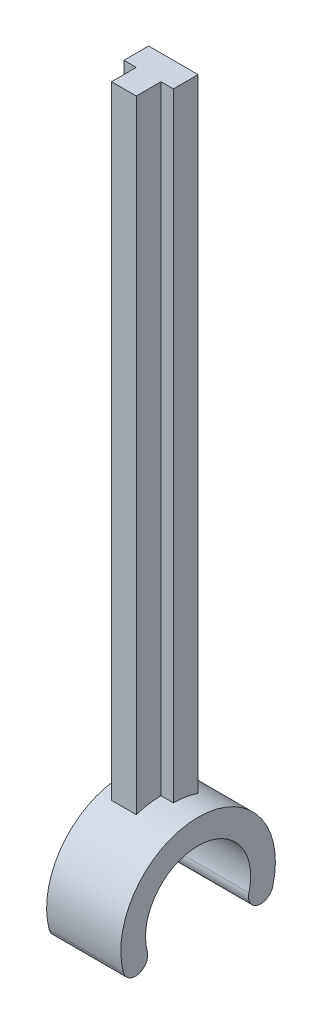
ISO-10303-21;
HEADER;
FILE_DESCRIPTION(('STEP AP214'),'2;1');
FILE_NAME('part.step','',(''),(''),'','','');
FILE_SCHEMA(('AUTOMOTIVE_DESIGN { 1 0 10303 214 1 1 1 1 }'));
ENDSEC;
DATA;
#1=APPLICATION_CONTEXT('core data for automotive mechanical design processes');
#2=APPLICATION_PROTOCOL_DEFINITION('international standard','automotive_design',2000,#1);
#3=PRODUCT_CONTEXT('',#1,'mechanical');
#4=PRODUCT('Part','Part','',(#3));
#5=PRODUCT_RELATED_PRODUCT_CATEGORY('part','',(#4));
#6=PRODUCT_DEFINITION_FORMATION('','',#4);
#7=PRODUCT_DEFINITION_CONTEXT('part definition',#1,'design');
#8=PRODUCT_DEFINITION('design','',#6,#7);
#9=PRODUCT_DEFINITION_SHAPE('','',#8);
#10=(LENGTH_UNIT() NAMED_UNIT(*) SI_UNIT(.MILLI.,.METRE.));
#11=(NAMED_UNIT(*) PLANE_ANGLE_UNIT() SI_UNIT($,.RADIAN.));
#12=(NAMED_UNIT(*) SI_UNIT($,.STERADIAN.) SOLID_ANGLE_UNIT());
#13=UNCERTAINTY_MEASURE_WITH_UNIT(LENGTH_MEASURE(1.E-05),#10,'distance_accuracy_value','');
#14=(GEOMETRIC_REPRESENTATION_CONTEXT(3) GLOBAL_UNCERTAINTY_ASSIGNED_CONTEXT((#13)) GLOBAL_UNIT_ASSIGNED_CONTEXT((#10,
#11,#12)) REPRESENTATION_CONTEXT('',''));
#15=CARTESIAN_POINT('',(0.,0.,0.));
#16=DIRECTION('',(0.,0.,1.));
#17=DIRECTION('',(1.,0.,0.));
#18=AXIS2_PLACEMENT_3D('',#15,#16,#17);
#19=CARTESIAN_POINT('',(-2.,0.,0.));
#20=DIRECTION('',(0.,0.,1.));
#21=DIRECTION('',(0.,-1.,0.));
#22=AXIS2_PLACEMENT_3D('',#19,#20,#21);
#23=PLANE('',#22);
#24=DIRECTION('',(1.,0.,0.));
#25=VECTOR('',#24,1.);
#26=CARTESIAN_POINT('',(-2.,56.25,0.));
#27=LINE('',#26,#25);
#28=CARTESIAN_POINT('',(1.,56.25,0.));
#29=VERTEX_POINT('',#28);
#30=CARTESIAN_POINT('',(2.,56.25,0.));
#31=VERTEX_POINT('',#30);
#32=EDGE_CURVE('E177',#29,#31,#27,.T.);
#33=ORIENTED_EDGE('',*,*,#32,.F.);
#34=DIRECTION('',(0.,1.,0.));
#35=VECTOR('',#34,1.);
#36=CARTESIAN_POINT('',(1.,56.25,0.));
#37=LINE('',#36,#35);
#38=CARTESIAN_POINT('',(1.,6.25000000000001,0.));
#39=VERTEX_POINT('',#38);
#40=EDGE_CURVE('E143',#39,#29,#37,.T.);
#41=ORIENTED_EDGE('',*,*,#40,.F.);
#42=DIRECTION('',(-1.,0.,0.));
#43=VECTOR('',#42,1.);
#44=CARTESIAN_POINT('',(4.,6.25,0.));
#45=LINE('',#44,#43);
#46=CARTESIAN_POINT('',(2.,6.25,0.));
#47=VERTEX_POINT('',#46);
#48=EDGE_CURVE('E183',#47,#39,#45,.T.);
#49=ORIENTED_EDGE('',*,*,#48,.F.);
#50=DIRECTION('',(0.,-1.,0.));
#51=VECTOR('',#50,1.);
#52=CARTESIAN_POINT('',(2.,0.,0.));
#53=LINE('',#52,#51);
#54=EDGE_CURVE('E61',#31,#47,#53,.T.);
#55=ORIENTED_EDGE('',*,*,#54,.F.);
#56=EDGE_LOOP('',(#33,#41,#49,#55));
#57=FACE_BOUND('',#56,.T.);
#58=ADVANCED_FACE('F38',(#57),#23,.T.);
#59=CARTESIAN_POINT('',(4.,0.,0.));
#60=DIRECTION('',(-1.,0.,0.));
#61=DIRECTION('',(0.,0.,1.));
#62=AXIS2_PLACEMENT_3D('',#59,#60,#61);
#63=CYLINDRICAL_SURFACE('',#62,4.25);
#64=DIRECTION('',(-1.,0.,0.));
#65=VECTOR('',#64,1.);
#66=CARTESIAN_POINT('',(4.,-1.09998094168572,4.10518476172854));
#67=LINE('',#66,#65);
#68=CARTESIAN_POINT('',(4.,-1.09998094168572,4.10518476172854));
#69=VERTEX_POINT('',#68);
#70=CARTESIAN_POINT('',(-2.,-1.09998094168572,4.10518476172854));
#71=VERTEX_POINT('',#70);
#72=EDGE_CURVE('E208',#69,#71,#67,.T.);
#73=ORIENTED_EDGE('',*,*,#72,.T.);
#74=CARTESIAN_POINT('',(-2.,0.,0.));
#75=DIRECTION('',(1.,0.,0.));
#76=DIRECTION('',(0.,0.,-1.));
#77=AXIS2_PLACEMENT_3D('',#74,#75,#76);
#78=CIRCLE('',#77,4.25);
#79=CARTESIAN_POINT('',(-2.,-1.09998094168572,-4.10518476172854));
#80=VERTEX_POINT('',#79);
#81=EDGE_CURVE('E186',#80,#71,#78,.T.);
#82=ORIENTED_EDGE('',*,*,#81,.F.);
#83=DIRECTION('',(-1.,0.,0.));
#84=VECTOR('',#83,1.);
#85=CARTESIAN_POINT('',(4.,-1.09998094168572,-4.10518476172854));
#86=LINE('',#85,#84);
#87=CARTESIAN_POINT('',(4.,-1.09998094168572,-4.10518476172854));
#88=VERTEX_POINT('',#87);
#89=EDGE_CURVE('E216',#88,#80,#86,.T.);
#90=ORIENTED_EDGE('',*,*,#89,.F.);
#91=CARTESIAN_POINT('',(4.,0.,0.));
#92=DIRECTION('',(1.,0.,0.));
#93=DIRECTION('',(0.,0.,-1.));
#94=AXIS2_PLACEMENT_3D('',#91,#92,#93);
#95=CIRCLE('',#94,4.25);
#96=EDGE_CURVE('E198',#88,#69,#95,.T.);
#97=ORIENTED_EDGE('',*,*,#96,.T.);
#98=EDGE_LOOP('',(#73,#82,#90,#97));
#99=FACE_BOUND('',#98,.T.);
#100=ADVANCED_FACE('F40',(#99),#63,.F.);
#101=CARTESIAN_POINT('',(4.,-1.35879998678824,-5.07111058801761));
#102=DIRECTION('',(-1.,0.,0.));
#103=DIRECTION('',(0.,0.,1.));
#104=AXIS2_PLACEMENT_3D('',#101,#102,#103);
#105=CYLINDRICAL_SURFACE('',#104,1.);
#106=ORIENTED_EDGE('',*,*,#89,.T.);
#107=CARTESIAN_POINT('',(-2.,-1.35879998678824,-5.07111058801761));
#108=DIRECTION('',(1.,0.,0.));
#109=DIRECTION('',(0.,0.,-1.));
#110=AXIS2_PLACEMENT_3D('',#107,#108,#109);
#111=CIRCLE('',#110,1.);
#112=CARTESIAN_POINT('',(-2.,-1.61761903189076,-6.03703641430667));
#113=VERTEX_POINT('',#112);
#114=EDGE_CURVE('E188',#113,#80,#111,.F.);
#115=ORIENTED_EDGE('',*,*,#114,.F.);
#116=DIRECTION('',(-1.,0.,0.));
#117=VECTOR('',#116,1.);
#118=CARTESIAN_POINT('',(4.,-1.61761903189076,-6.03703641430667));
#119=LINE('',#118,#117);
#120=CARTESIAN_POINT('',(4.,-1.61761903189076,-6.03703641430667));
#121=VERTEX_POINT('',#120);
#122=EDGE_CURVE('E214',#121,#113,#119,.T.);
#123=ORIENTED_EDGE('',*,*,#122,.F.);
#124=CARTESIAN_POINT('',(4.,-1.35879998678824,-5.07111058801761));
#125=DIRECTION('',(1.,0.,0.));
#126=DIRECTION('',(0.,0.,-1.));
#127=AXIS2_PLACEMENT_3D('',#124,#125,#126);
#128=CIRCLE('',#127,1.);
#129=EDGE_CURVE('E201',#121,#88,#128,.F.);
#130=ORIENTED_EDGE('',*,*,#129,.T.);
#131=EDGE_LOOP('',(#106,#115,#123,#130));
#132=FACE_BOUND('',#131,.T.);
#133=ADVANCED_FACE('F234',(#132),#105,.T.);
#134=CARTESIAN_POINT('',(4.,0.,0.));
#135=DIRECTION('',(-1.,0.,0.));
#136=DIRECTION('',(0.,0.,1.));
#137=AXIS2_PLACEMENT_3D('',#134,#135,#136);
#138=CYLINDRICAL_SURFACE('',#137,6.25);
#139=DIRECTION('',(-1.,0.,0.));
#140=VECTOR('',#139,1.);
#141=CARTESIAN_POINT('',(4.,5.92135964116351,1.99999999999999));
#142=LINE('',#141,#140);
#143=CARTESIAN_POINT('',(1.,5.92135964116351,1.99999999999999));
#144=VERTEX_POINT('',#143);
#145=CARTESIAN_POINT('',(-1.,5.92135964116351,1.99999999999999));
#146=VERTEX_POINT('',#145);
#147=EDGE_CURVE('E11',#144,#146,#142,.T.);
#148=ORIENTED_EDGE('',*,*,#147,.T.);
#149=CARTESIAN_POINT('',(-1.,0.,0.));
#150=DIRECTION('',(-1.,0.,0.));
#151=DIRECTION('',(0.,0.,1.));
#152=AXIS2_PLACEMENT_3D('',#149,#150,#151);
#153=CIRCLE('',#152,6.25);
#154=CARTESIAN_POINT('',(-1.,6.25000000000001,0.));
#155=VERTEX_POINT('',#154);
#156=EDGE_CURVE('E156',#146,#155,#153,.T.);
#157=ORIENTED_EDGE('',*,*,#156,.T.);
#158=CARTESIAN_POINT('',(-2.,6.25,0.));
#159=VERTEX_POINT('',#158);
#160=EDGE_CURVE('E182',#155,#159,#45,.T.);
#161=ORIENTED_EDGE('',*,*,#160,.T.);
#162=CARTESIAN_POINT('',(-2.,0.,0.));
#163=DIRECTION('',(1.,0.,0.));
#164=DIRECTION('',(0.,0.,-1.));
#165=AXIS2_PLACEMENT_3D('',#162,#163,#164);
#166=CIRCLE('',#165,6.25);
#167=CARTESIAN_POINT('',(-2.,-1.61761903189076,6.03703641430667));
#168=VERTEX_POINT('',#167);
#169=EDGE_CURVE('E191',#159,#168,#166,.T.);
#170=ORIENTED_EDGE('',*,*,#169,.T.);
#171=DIRECTION('',(-1.,0.,0.));
#172=VECTOR('',#171,1.);
#173=CARTESIAN_POINT('',(4.,-1.61761903189076,6.03703641430667));
#174=LINE('',#173,#172);
#175=CARTESIAN_POINT('',(4.,-1.61761903189076,6.03703641430667));
#176=VERTEX_POINT('',#175);
#177=EDGE_CURVE('E211',#176,#168,#174,.T.);
#178=ORIENTED_EDGE('',*,*,#177,.F.);
#179=CARTESIAN_POINT('',(4.,0.,0.));
#180=DIRECTION('',(1.,0.,0.));
#181=DIRECTION('',(0.,0.,-1.));
#182=AXIS2_PLACEMENT_3D('',#179,#180,#181);
#183=CIRCLE('',#182,6.25);
#184=EDGE_CURVE('E204',#121,#176,#183,.T.);
#185=ORIENTED_EDGE('',*,*,#184,.F.);
#186=ORIENTED_EDGE('',*,*,#122,.T.);
#187=CARTESIAN_POINT('',(-2.,5.92135964116351,-2.));
#188=VERTEX_POINT('',#187);
#189=EDGE_CURVE('E192',#113,#188,#166,.T.);
#190=ORIENTED_EDGE('',*,*,#189,.T.);
#191=DIRECTION('',(-1.,0.,0.));
#192=VECTOR('',#191,1.);
#193=CARTESIAN_POINT('',(4.,5.92135964116351,-2.));
#194=LINE('',#193,#192);
#195=CARTESIAN_POINT('',(2.,5.92135964116351,-2.));
#196=VERTEX_POINT('',#195);
#197=EDGE_CURVE('E176',#188,#196,#194,.F.);
#198=ORIENTED_EDGE('',*,*,#197,.T.);
#199=CARTESIAN_POINT('',(2.,0.,0.));
#200=DIRECTION('',(1.,0.,0.));
#201=DIRECTION('',(0.,0.,-1.));
#202=AXIS2_PLACEMENT_3D('',#199,#200,#201);
#203=CIRCLE('',#202,6.25);
#204=EDGE_CURVE('E46',#196,#47,#203,.T.);
#205=ORIENTED_EDGE('',*,*,#204,.T.);
#206=ORIENTED_EDGE('',*,*,#48,.T.);
#207=CARTESIAN_POINT('',(1.,0.,0.));
#208=DIRECTION('',(-1.,0.,0.));
#209=DIRECTION('',(0.,0.,1.));
#210=AXIS2_PLACEMENT_3D('',#207,#208,#209);
#211=CIRCLE('',#210,6.25);
#212=EDGE_CURVE('E134',#144,#39,#211,.T.);
#213=ORIENTED_EDGE('',*,*,#212,.F.);
#214=EDGE_LOOP('',(#148,#157,#161,#170,#178,#185,#186,#190,#198,#205,#206,#213));
#215=FACE_BOUND('',#214,.T.);
#216=ADVANCED_FACE('F219',(#215),#138,.T.);
#217=CARTESIAN_POINT('',(4.,-1.35879998678824,5.07111058801761));
#218=DIRECTION('',(-1.,0.,0.));
#219=DIRECTION('',(0.,0.,1.));
#220=AXIS2_PLACEMENT_3D('',#217,#218,#219);
#221=CYLINDRICAL_SURFACE('',#220,1.);
#222=ORIENTED_EDGE('',*,*,#177,.T.);
#223=CARTESIAN_POINT('',(-2.,-1.35879998678824,5.07111058801761));
#224=DIRECTION('',(1.,0.,0.));
#225=DIRECTION('',(0.,0.,-1.));
#226=AXIS2_PLACEMENT_3D('',#223,#224,#225);
#227=CIRCLE('',#226,1.);
#228=EDGE_CURVE('E195',#168,#71,#227,.T.);
#229=ORIENTED_EDGE('',*,*,#228,.T.);
#230=ORIENTED_EDGE('',*,*,#72,.F.);
#231=CARTESIAN_POINT('',(4.,-1.35879998678824,5.07111058801761));
#232=DIRECTION('',(1.,0.,0.));
#233=DIRECTION('',(0.,0.,-1.));
#234=AXIS2_PLACEMENT_3D('',#231,#232,#233);
#235=CIRCLE('',#234,1.);
#236=EDGE_CURVE('E206',#176,#69,#235,.T.);
#237=ORIENTED_EDGE('',*,*,#236,.F.);
#238=EDGE_LOOP('',(#222,#229,#230,#237));
#239=FACE_BOUND('',#238,.T.);
#240=ADVANCED_FACE('F258',(#239),#221,.T.);
#241=CARTESIAN_POINT('',(4.,0.,0.));
#242=DIRECTION('',(1.,0.,0.));
#243=DIRECTION('',(0.,0.,-1.));
#244=AXIS2_PLACEMENT_3D('',#241,#242,#243);
#245=PLANE('',#244);
#246=ORIENTED_EDGE('',*,*,#96,.F.);
#247=ORIENTED_EDGE('',*,*,#129,.F.);
#248=ORIENTED_EDGE('',*,*,#184,.T.);
#249=ORIENTED_EDGE('',*,*,#236,.T.);
#250=EDGE_LOOP('',(#246,#247,#248,#249));
#251=FACE_BOUND('',#250,.T.);
#252=ADVANCED_FACE('F246',(#251),#245,.T.);
#253=CARTESIAN_POINT('',(-2.,0.,0.));
#254=DIRECTION('',(1.,0.,0.));
#255=DIRECTION('',(0.,0.,-1.));
#256=AXIS2_PLACEMENT_3D('',#253,#254,#255);
#257=PLANE('',#256);
#258=ORIENTED_EDGE('',*,*,#81,.T.);
#259=ORIENTED_EDGE('',*,*,#228,.F.);
#260=ORIENTED_EDGE('',*,*,#169,.F.);
#261=DIRECTION('',(0.,-1.,0.));
#262=VECTOR('',#261,1.);
#263=CARTESIAN_POINT('',(-2.,0.,0.));
#264=LINE('',#263,#262);
#265=CARTESIAN_POINT('',(-2.,56.25,0.));
#266=VERTEX_POINT('',#265);
#267=EDGE_CURVE('E170',#266,#159,#264,.T.);
#268=ORIENTED_EDGE('',*,*,#267,.F.);
#269=DIRECTION('',(0.,0.,-1.));
#270=VECTOR('',#269,1.);
#271=CARTESIAN_POINT('',(-2.,56.25,0.));
#272=LINE('',#271,#270);
#273=CARTESIAN_POINT('',(-2.,56.25,-2.));
#274=VERTEX_POINT('',#273);
#275=EDGE_CURVE('E167',#266,#274,#272,.T.);
#276=ORIENTED_EDGE('',*,*,#275,.T.);
#277=DIRECTION('',(0.,1.,0.));
#278=VECTOR('',#277,1.);
#279=CARTESIAN_POINT('',(-2.,0.,-2.));
#280=LINE('',#279,#278);
#281=EDGE_CURVE('E165',#188,#274,#280,.T.);
#282=ORIENTED_EDGE('',*,*,#281,.F.);
#283=ORIENTED_EDGE('',*,*,#189,.F.);
#284=ORIENTED_EDGE('',*,*,#114,.T.);
#285=EDGE_LOOP('',(#258,#259,#260,#268,#276,#282,#283,#284));
#286=FACE_BOUND('',#285,.T.);
#287=ADVANCED_FACE('F239',(#286),#257,.F.);
#288=DIRECTION('',(0.,1.,0.));
#289=VECTOR('',#288,1.);
#290=CARTESIAN_POINT('',(-1.,56.25,0.));
#291=LINE('',#290,#289);
#292=CARTESIAN_POINT('',(-1.,56.25,0.));
#293=VERTEX_POINT('',#292);
#294=EDGE_CURVE('E147',#155,#293,#291,.T.);
#295=ORIENTED_EDGE('',*,*,#294,.T.);
#296=EDGE_CURVE('E174',#266,#293,#27,.T.);
#297=ORIENTED_EDGE('',*,*,#296,.F.);
#298=ORIENTED_EDGE('',*,*,#267,.T.);
#299=ORIENTED_EDGE('',*,*,#160,.F.);
#300=EDGE_LOOP('',(#295,#297,#298,#299));
#301=FACE_BOUND('',#300,.T.);
#302=ADVANCED_FACE('F230',(#301),#23,.T.);
#303=CARTESIAN_POINT('',(-2.,0.,-2.));
#304=DIRECTION('',(0.,0.,-1.));
#305=DIRECTION('',(-1.,0.,0.));
#306=AXIS2_PLACEMENT_3D('',#303,#304,#305);
#307=PLANE('',#306);
#308=ORIENTED_EDGE('',*,*,#197,.F.);
#309=ORIENTED_EDGE('',*,*,#281,.T.);
#310=DIRECTION('',(1.,0.,0.));
#311=VECTOR('',#310,1.);
#312=CARTESIAN_POINT('',(-2.,56.25,-2.));
#313=LINE('',#312,#311);
#314=CARTESIAN_POINT('',(2.,56.25,-2.));
#315=VERTEX_POINT('',#314);
#316=EDGE_CURVE('E173',#274,#315,#313,.T.);
#317=ORIENTED_EDGE('',*,*,#316,.T.);
#318=DIRECTION('',(0.,1.,0.));
#319=VECTOR('',#318,1.);
#320=CARTESIAN_POINT('',(2.,0.,-2.));
#321=LINE('',#320,#319);
#322=EDGE_CURVE('E159',#196,#315,#321,.T.);
#323=ORIENTED_EDGE('',*,*,#322,.F.);
#324=EDGE_LOOP('',(#308,#309,#317,#323));
#325=FACE_BOUND('',#324,.T.);
#326=ADVANCED_FACE('F223',(#325),#307,.T.);
#327=CARTESIAN_POINT('',(-2.,56.25,0.));
#328=DIRECTION('',(0.,-1.,0.));
#329=DIRECTION('',(0.,0.,-1.));
#330=AXIS2_PLACEMENT_3D('',#327,#328,#329);
#331=PLANE('',#330);
#332=ORIENTED_EDGE('',*,*,#296,.T.);
#333=DIRECTION('',(0.,0.,1.));
#334=VECTOR('',#333,1.);
#335=CARTESIAN_POINT('',(-1.,56.25,0.));
#336=LINE('',#335,#334);
#337=CARTESIAN_POINT('',(-1.,56.25,2.));
#338=VERTEX_POINT('',#337);
#339=EDGE_CURVE('E129',#293,#338,#336,.T.);
#340=ORIENTED_EDGE('',*,*,#339,.T.);
#341=DIRECTION('',(1.,0.,0.));
#342=VECTOR('',#341,1.);
#343=CARTESIAN_POINT('',(-1.,56.25,2.));
#344=LINE('',#343,#342);
#345=CARTESIAN_POINT('',(1.,56.25,2.));
#346=VERTEX_POINT('',#345);
#347=EDGE_CURVE('E126',#338,#346,#344,.T.);
#348=ORIENTED_EDGE('',*,*,#347,.T.);
#349=DIRECTION('',(0.,0.,1.));
#350=VECTOR('',#349,1.);
#351=CARTESIAN_POINT('',(1.,56.25,0.));
#352=LINE('',#351,#350);
#353=EDGE_CURVE('E53',#29,#346,#352,.T.);
#354=ORIENTED_EDGE('',*,*,#353,.F.);
#355=ORIENTED_EDGE('',*,*,#32,.T.);
#356=DIRECTION('',(0.,0.,-1.));
#357=VECTOR('',#356,1.);
#358=CARTESIAN_POINT('',(2.,56.25,0.));
#359=LINE('',#358,#357);
#360=EDGE_CURVE('E161',#31,#315,#359,.T.);
#361=ORIENTED_EDGE('',*,*,#360,.T.);
#362=ORIENTED_EDGE('',*,*,#316,.F.);
#363=ORIENTED_EDGE('',*,*,#275,.F.);
#364=EDGE_LOOP('',(#332,#340,#348,#354,#355,#361,#362,#363));
#365=FACE_BOUND('',#364,.T.);
#366=ADVANCED_FACE('F128',(#365),#331,.F.);
#367=CARTESIAN_POINT('',(2.,0.,0.));
#368=DIRECTION('',(1.,0.,0.));
#369=DIRECTION('',(0.,0.,-1.));
#370=AXIS2_PLACEMENT_3D('',#367,#368,#369);
#371=PLANE('',#370);
#372=ORIENTED_EDGE('',*,*,#204,.F.);
#373=ORIENTED_EDGE('',*,*,#322,.T.);
#374=ORIENTED_EDGE('',*,*,#360,.F.);
#375=ORIENTED_EDGE('',*,*,#54,.T.);
#376=EDGE_LOOP('',(#372,#373,#374,#375));
#377=FACE_BOUND('',#376,.T.);
#378=ADVANCED_FACE('F221',(#377),#371,.T.);
#379=CARTESIAN_POINT('',(-1.,56.25,2.));
#380=DIRECTION('',(0.,0.,1.));
#381=DIRECTION('',(0.,-1.,0.));
#382=AXIS2_PLACEMENT_3D('',#379,#380,#381);
#383=PLANE('',#382);
#384=ORIENTED_EDGE('',*,*,#147,.F.);
#385=DIRECTION('',(0.,-1.,0.));
#386=VECTOR('',#385,1.);
#387=CARTESIAN_POINT('',(1.,56.25,2.));
#388=LINE('',#387,#386);
#389=EDGE_CURVE('E140',#346,#144,#388,.T.);
#390=ORIENTED_EDGE('',*,*,#389,.F.);
#391=ORIENTED_EDGE('',*,*,#347,.F.);
#392=DIRECTION('',(0.,-1.,0.));
#393=VECTOR('',#392,1.);
#394=CARTESIAN_POINT('',(-1.,56.25,2.));
#395=LINE('',#394,#393);
#396=EDGE_CURVE('E135',#338,#146,#395,.T.);
#397=ORIENTED_EDGE('',*,*,#396,.T.);
#398=EDGE_LOOP('',(#384,#390,#391,#397));
#399=FACE_BOUND('',#398,.T.);
#400=ADVANCED_FACE('F146',(#399),#383,.T.);
#401=CARTESIAN_POINT('',(-1.,0.,0.));
#402=DIRECTION('',(-1.,0.,0.));
#403=DIRECTION('',(0.,0.,1.));
#404=AXIS2_PLACEMENT_3D('',#401,#402,#403);
#405=PLANE('',#404);
#406=ORIENTED_EDGE('',*,*,#156,.F.);
#407=ORIENTED_EDGE('',*,*,#396,.F.);
#408=ORIENTED_EDGE('',*,*,#339,.F.);
#409=ORIENTED_EDGE('',*,*,#294,.F.);
#410=EDGE_LOOP('',(#406,#407,#408,#409));
#411=FACE_BOUND('',#410,.T.);
#412=ADVANCED_FACE('F283',(#411),#405,.T.);
#413=CARTESIAN_POINT('',(1.,0.,0.));
#414=DIRECTION('',(-1.,0.,0.));
#415=DIRECTION('',(0.,0.,1.));
#416=AXIS2_PLACEMENT_3D('',#413,#414,#415);
#417=PLANE('',#416);
#418=ORIENTED_EDGE('',*,*,#389,.T.);
#419=ORIENTED_EDGE('',*,*,#212,.T.);
#420=ORIENTED_EDGE('',*,*,#40,.T.);
#421=ORIENTED_EDGE('',*,*,#353,.T.);
#422=EDGE_LOOP('',(#418,#419,#420,#421));
#423=FACE_BOUND('',#422,.T.);
#424=ADVANCED_FACE('F139',(#423),#417,.F.);
#425=CLOSED_SHELL('',(#58,#100,#133,#216,#240,#252,#287,#302,#326,#366,#378,#400,#412,#424));
#426=MANIFOLD_SOLID_BREP('B2',#425);
#427=ADVANCED_BREP_SHAPE_REPRESENTATION('',(#18,#426),#14);
#428=SHAPE_DEFINITION_REPRESENTATION(#9,#427);
ENDSEC;
END-ISO-10303-21;
